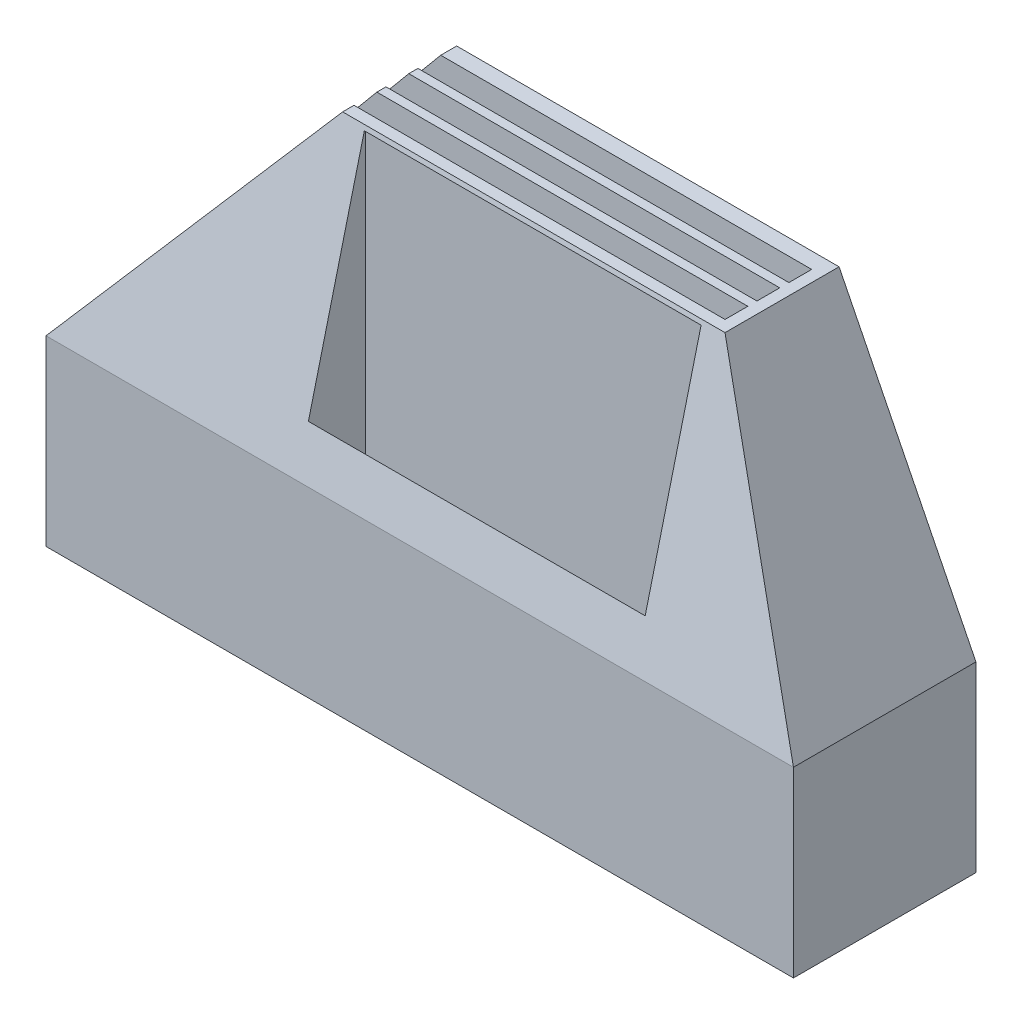
ISO-10303-21;
HEADER;
FILE_DESCRIPTION(('STEP AP214'),'2;1');
FILE_NAME('part.step','',(''),(''),'','','');
FILE_SCHEMA(('AUTOMOTIVE_DESIGN { 1 0 10303 214 1 1 1 1 }'));
ENDSEC;
DATA;
#1=APPLICATION_CONTEXT('core data for automotive mechanical design processes');
#2=APPLICATION_PROTOCOL_DEFINITION('international standard','automotive_design',2000,#1);
#3=PRODUCT_CONTEXT('',#1,'mechanical');
#4=PRODUCT('Part','Part','',(#3));
#5=PRODUCT_RELATED_PRODUCT_CATEGORY('part','',(#4));
#6=PRODUCT_DEFINITION_FORMATION('','',#4);
#7=PRODUCT_DEFINITION_CONTEXT('part definition',#1,'design');
#8=PRODUCT_DEFINITION('design','',#6,#7);
#9=PRODUCT_DEFINITION_SHAPE('','',#8);
#10=(LENGTH_UNIT() NAMED_UNIT(*) SI_UNIT(.MILLI.,.METRE.));
#11=(NAMED_UNIT(*) PLANE_ANGLE_UNIT() SI_UNIT($,.RADIAN.));
#12=(NAMED_UNIT(*) SI_UNIT($,.STERADIAN.) SOLID_ANGLE_UNIT());
#13=UNCERTAINTY_MEASURE_WITH_UNIT(LENGTH_MEASURE(1.E-05),#10,'distance_accuracy_value','');
#14=(GEOMETRIC_REPRESENTATION_CONTEXT(3) GLOBAL_UNCERTAINTY_ASSIGNED_CONTEXT((#13)) GLOBAL_UNIT_ASSIGNED_CONTEXT((#10,
#11,#12)) REPRESENTATION_CONTEXT('',''));
#15=CARTESIAN_POINT('',(0.,0.,0.));
#16=DIRECTION('',(0.,0.,1.));
#17=DIRECTION('',(1.,0.,0.));
#18=AXIS2_PLACEMENT_3D('',#15,#16,#17);
#19=CARTESIAN_POINT('',(0.,0.,0.));
#20=DIRECTION('',(0.,-1.,0.));
#21=DIRECTION('',(0.,0.,-1.));
#22=AXIS2_PLACEMENT_3D('',#19,#20,#21);
#23=PLANE('',#22);
#24=DIRECTION('',(0.,0.,1.));
#25=VECTOR('',#24,1.);
#26=CARTESIAN_POINT('',(0.,0.,0.));
#27=LINE('',#26,#25);
#28=CARTESIAN_POINT('',(-1.38777878078145E-13,0.,-101.6));
#29=VERTEX_POINT('',#28);
#30=CARTESIAN_POINT('',(0.,0.,0.));
#31=VERTEX_POINT('',#30);
#32=EDGE_CURVE('E416',#29,#31,#27,.T.);
#33=ORIENTED_EDGE('',*,*,#32,.F.);
#34=DIRECTION('',(-1.,0.,0.));
#35=VECTOR('',#34,1.);
#36=CARTESIAN_POINT('',(-1.38777878078145E-13,0.,-101.6));
#37=LINE('',#36,#35);
#38=CARTESIAN_POINT('',(416.08,0.,-101.6));
#39=VERTEX_POINT('',#38);
#40=EDGE_CURVE('E432',#39,#29,#37,.T.);
#41=ORIENTED_EDGE('',*,*,#40,.F.);
#42=DIRECTION('',(0.,0.,-1.));
#43=VECTOR('',#42,1.);
#44=CARTESIAN_POINT('',(416.08,0.,1.11022302462516E-13));
#45=LINE('',#44,#43);
#46=CARTESIAN_POINT('',(416.08,0.,1.11022302462516E-13));
#47=VERTEX_POINT('',#46);
#48=EDGE_CURVE('E438',#47,#39,#45,.T.);
#49=ORIENTED_EDGE('',*,*,#48,.F.);
#50=DIRECTION('',(1.,0.,0.));
#51=VECTOR('',#50,1.);
#52=CARTESIAN_POINT('',(0.,0.,0.));
#53=LINE('',#52,#51);
#54=EDGE_CURVE('E435',#31,#47,#53,.T.);
#55=ORIENTED_EDGE('',*,*,#54,.F.);
#56=EDGE_LOOP('',(#33,#41,#49,#55));
#57=FACE_BOUND('',#56,.T.);
#58=DIRECTION('',(1.,0.,0.));
#59=VECTOR('',#58,1.);
#60=CARTESIAN_POINT('',(139.7,0.,-6.35));
#61=LINE('',#60,#59);
#62=CARTESIAN_POINT('',(139.7,0.,-6.35));
#63=VERTEX_POINT('',#62);
#64=CARTESIAN_POINT('',(327.18,0.,-6.34999999999998));
#65=VERTEX_POINT('',#64);
#66=EDGE_CURVE('E383',#63,#65,#61,.T.);
#67=ORIENTED_EDGE('',*,*,#66,.T.);
#68=DIRECTION('',(0.,0.,-1.));
#69=VECTOR('',#68,1.);
#70=CARTESIAN_POINT('',(327.18,0.,-38.1));
#71=LINE('',#70,#69);
#72=CARTESIAN_POINT('',(327.18,0.,-38.1));
#73=VERTEX_POINT('',#72);
#74=EDGE_CURVE('E316',#65,#73,#71,.T.);
#75=ORIENTED_EDGE('',*,*,#74,.T.);
#76=DIRECTION('',(-1.,0.,0.));
#77=VECTOR('',#76,1.);
#78=CARTESIAN_POINT('',(139.7,0.,-38.1));
#79=LINE('',#78,#77);
#80=CARTESIAN_POINT('',(139.7,0.,-38.1));
#81=VERTEX_POINT('',#80);
#82=EDGE_CURVE('E391',#73,#81,#79,.T.);
#83=ORIENTED_EDGE('',*,*,#82,.T.);
#84=DIRECTION('',(0.,0.,1.));
#85=VECTOR('',#84,1.);
#86=CARTESIAN_POINT('',(139.7,0.,-38.1));
#87=LINE('',#86,#85);
#88=EDGE_CURVE('E394',#81,#63,#87,.T.);
#89=ORIENTED_EDGE('',*,*,#88,.T.);
#90=EDGE_LOOP('',(#67,#75,#83,#89));
#91=FACE_BOUND('',#90,.T.);
#92=ADVANCED_FACE('F41',(#57,#91),#23,.T.);
#93=CARTESIAN_POINT('',(0.,254.,0.));
#94=DIRECTION('',(1.,0.,0.));
#95=DIRECTION('',(0.,0.,-1.));
#96=AXIS2_PLACEMENT_3D('',#93,#94,#95);
#97=PLANE('',#96);
#98=DIRECTION('',(0.,-1.,0.));
#99=VECTOR('',#98,1.);
#100=CARTESIAN_POINT('',(0.,254.,0.));
#101=LINE('',#100,#99);
#102=CARTESIAN_POINT('',(-1.11022302462516E-13,101.6,0.));
#103=VERTEX_POINT('',#102);
#104=EDGE_CURVE('E448',#103,#31,#101,.T.);
#105=ORIENTED_EDGE('',*,*,#104,.F.);
#106=DIRECTION('',(0.,0.,1.));
#107=VECTOR('',#106,1.);
#108=CARTESIAN_POINT('',(0.,101.6,-101.6));
#109=LINE('',#108,#107);
#110=CARTESIAN_POINT('',(0.,101.6,-101.6));
#111=VERTEX_POINT('',#110);
#112=EDGE_CURVE('E413',#111,#103,#109,.T.);
#113=ORIENTED_EDGE('',*,*,#112,.F.);
#114=DIRECTION('',(0.,-1.,0.));
#115=VECTOR('',#114,1.);
#116=CARTESIAN_POINT('',(-1.38777878078145E-13,254.,-101.6));
#117=LINE('',#116,#115);
#118=EDGE_CURVE('E431',#111,#29,#117,.T.);
#119=ORIENTED_EDGE('',*,*,#118,.T.);
#120=ORIENTED_EDGE('',*,*,#32,.T.);
#121=EDGE_LOOP('',(#105,#113,#119,#120));
#122=FACE_BOUND('',#121,.T.);
#123=ADVANCED_FACE('F43',(#122),#97,.F.);
#124=CARTESIAN_POINT('',(0.,254.,0.));
#125=DIRECTION('',(0.,0.,-1.));
#126=DIRECTION('',(-1.,0.,0.));
#127=AXIS2_PLACEMENT_3D('',#124,#125,#126);
#128=PLANE('',#127);
#129=DIRECTION('',(0.,-1.,0.));
#130=VECTOR('',#129,1.);
#131=CARTESIAN_POINT('',(416.08,254.,1.11022302462516E-13));
#132=LINE('',#131,#130);
#133=CARTESIAN_POINT('',(416.08,101.6,0.));
#134=VERTEX_POINT('',#133);
#135=EDGE_CURVE('E446',#134,#47,#132,.T.);
#136=ORIENTED_EDGE('',*,*,#135,.F.);
#137=DIRECTION('',(1.,0.,0.));
#138=VECTOR('',#137,1.);
#139=CARTESIAN_POINT('',(-1.11022302462516E-13,101.6,0.));
#140=LINE('',#139,#138);
#141=EDGE_CURVE('E252',#103,#134,#140,.T.);
#142=ORIENTED_EDGE('',*,*,#141,.F.);
#143=ORIENTED_EDGE('',*,*,#104,.T.);
#144=ORIENTED_EDGE('',*,*,#54,.T.);
#145=EDGE_LOOP('',(#136,#142,#143,#144));
#146=FACE_BOUND('',#145,.T.);
#147=ADVANCED_FACE('F538',(#146),#128,.F.);
#148=CARTESIAN_POINT('',(416.08,254.,1.11022302462516E-13));
#149=DIRECTION('',(-1.,0.,0.));
#150=DIRECTION('',(0.,0.,1.));
#151=AXIS2_PLACEMENT_3D('',#148,#149,#150);
#152=PLANE('',#151);
#153=DIRECTION('',(0.,-1.,0.));
#154=VECTOR('',#153,1.);
#155=CARTESIAN_POINT('',(416.08,254.,-101.6));
#156=LINE('',#155,#154);
#157=CARTESIAN_POINT('',(416.08,101.6,-101.6));
#158=VERTEX_POINT('',#157);
#159=EDGE_CURVE('E444',#158,#39,#156,.T.);
#160=ORIENTED_EDGE('',*,*,#159,.F.);
#161=DIRECTION('',(0.,0.,1.));
#162=VECTOR('',#161,1.);
#163=CARTESIAN_POINT('',(416.08,101.6,-101.6));
#164=LINE('',#163,#162);
#165=EDGE_CURVE('E407',#158,#134,#164,.T.);
#166=ORIENTED_EDGE('',*,*,#165,.T.);
#167=ORIENTED_EDGE('',*,*,#135,.T.);
#168=ORIENTED_EDGE('',*,*,#48,.T.);
#169=EDGE_LOOP('',(#160,#166,#167,#168));
#170=FACE_BOUND('',#169,.T.);
#171=ADVANCED_FACE('F547',(#170),#152,.F.);
#172=CARTESIAN_POINT('',(-1.38777878078145E-13,254.,-101.6));
#173=DIRECTION('',(0.,0.,1.));
#174=DIRECTION('',(1.,0.,0.));
#175=AXIS2_PLACEMENT_3D('',#172,#173,#174);
#176=PLANE('',#175);
#177=DIRECTION('',(-1.,0.,0.));
#178=VECTOR('',#177,1.);
#179=CARTESIAN_POINT('',(314.48,10.4540584538938,-101.6));
#180=LINE('',#179,#178);
#181=CARTESIAN_POINT('',(314.48,10.4540584538938,-101.6));
#182=VERTEX_POINT('',#181);
#183=CARTESIAN_POINT('',(152.4,10.4540584538938,-101.6));
#184=VERTEX_POINT('',#183);
#185=EDGE_CURVE('E258',#182,#184,#180,.T.);
#186=ORIENTED_EDGE('',*,*,#185,.F.);
#187=DIRECTION('',(0.,-1.,0.));
#188=VECTOR('',#187,1.);
#189=CARTESIAN_POINT('',(314.48,10.4540584538938,-101.6));
#190=LINE('',#189,#188);
#191=CARTESIAN_POINT('',(314.48,23.6587076548535,-101.6));
#192=VERTEX_POINT('',#191);
#193=EDGE_CURVE('E240',#192,#182,#190,.T.);
#194=ORIENTED_EDGE('',*,*,#193,.F.);
#195=DIRECTION('',(1.,0.,0.));
#196=VECTOR('',#195,1.);
#197=CARTESIAN_POINT('',(314.48,23.6587076548535,-101.6));
#198=LINE('',#197,#196);
#199=CARTESIAN_POINT('',(152.4,23.6587076548535,-101.6));
#200=VERTEX_POINT('',#199);
#201=EDGE_CURVE('E249',#200,#192,#198,.T.);
#202=ORIENTED_EDGE('',*,*,#201,.F.);
#203=DIRECTION('',(0.,1.,0.));
#204=VECTOR('',#203,1.);
#205=CARTESIAN_POINT('',(152.4,10.4540584538938,-101.6));
#206=LINE('',#205,#204);
#207=EDGE_CURVE('E56',#184,#200,#206,.T.);
#208=ORIENTED_EDGE('',*,*,#207,.F.);
#209=EDGE_LOOP('',(#186,#194,#202,#208));
#210=FACE_BOUND('',#209,.T.);
#211=ORIENTED_EDGE('',*,*,#118,.F.);
#212=DIRECTION('',(0.64018439966448,0.768221279597376,0.));
#213=VECTOR('',#212,1.);
#214=CARTESIAN_POINT('',(127.,254.,-101.6));
#215=LINE('',#214,#213);
#216=CARTESIAN_POINT('',(127.,254.,-101.6));
#217=VERTEX_POINT('',#216);
#218=EDGE_CURVE('E408',#111,#217,#215,.T.);
#219=ORIENTED_EDGE('',*,*,#218,.T.);
#220=DIRECTION('',(-1.,0.,0.));
#221=VECTOR('',#220,1.);
#222=CARTESIAN_POINT('',(-1.38777878078145E-13,254.,-101.6));
#223=LINE('',#222,#221);
#224=CARTESIAN_POINT('',(339.88,254.,-101.6));
#225=VERTEX_POINT('',#224);
#226=EDGE_CURVE('E428',#225,#217,#223,.T.);
#227=ORIENTED_EDGE('',*,*,#226,.F.);
#228=DIRECTION('',(0.447213595499958,-0.894427190999916,0.));
#229=VECTOR('',#228,1.);
#230=CARTESIAN_POINT('',(416.08,101.6,-101.6));
#231=LINE('',#230,#229);
#232=EDGE_CURVE('E412',#225,#158,#231,.T.);
#233=ORIENTED_EDGE('',*,*,#232,.T.);
#234=ORIENTED_EDGE('',*,*,#159,.T.);
#235=ORIENTED_EDGE('',*,*,#40,.T.);
#236=EDGE_LOOP('',(#211,#219,#227,#233,#234,#235));
#237=FACE_BOUND('',#236,.T.);
#238=ADVANCED_FACE('F255',(#210,#237),#176,.F.);
#239=CARTESIAN_POINT('',(0.,254.,0.));
#240=DIRECTION('',(0.,-1.,0.));
#241=DIRECTION('',(0.,0.,-1.));
#242=AXIS2_PLACEMENT_3D('',#239,#240,#241);
#243=PLANE('',#242);
#244=DIRECTION('',(0.,0.,1.));
#245=VECTOR('',#244,1.);
#246=CARTESIAN_POINT('',(127.,254.,-101.6));
#247=LINE('',#246,#245);
#248=CARTESIAN_POINT('',(127.,254.,-44.45));
#249=VERTEX_POINT('',#248);
#250=CARTESIAN_POINT('',(127.,254.,-38.1));
#251=VERTEX_POINT('',#250);
#252=EDGE_CURVE('E411',#249,#251,#247,.T.);
#253=ORIENTED_EDGE('',*,*,#252,.T.);
#254=DIRECTION('',(1.,0.,0.));
#255=VECTOR('',#254,1.);
#256=CARTESIAN_POINT('',(-1.11022302462516E-13,254.,-38.1));
#257=LINE('',#256,#255);
#258=CARTESIAN_POINT('',(339.88,254.,-38.1));
#259=VERTEX_POINT('',#258);
#260=EDGE_CURVE('E275',#251,#259,#257,.T.);
#261=ORIENTED_EDGE('',*,*,#260,.T.);
#262=DIRECTION('',(0.,0.,1.));
#263=VECTOR('',#262,1.);
#264=CARTESIAN_POINT('',(339.88,254.,-101.6));
#265=LINE('',#264,#263);
#266=EDGE_CURVE('E421',#225,#259,#265,.T.);
#267=ORIENTED_EDGE('',*,*,#266,.F.);
#268=ORIENTED_EDGE('',*,*,#226,.T.);
#269=CARTESIAN_POINT('',(127.,254.,-92.71));
#270=VERTEX_POINT('',#269);
#271=EDGE_CURVE('E417',#217,#270,#247,.T.);
#272=ORIENTED_EDGE('',*,*,#271,.T.);
#273=DIRECTION('',(-1.,0.,0.));
#274=VECTOR('',#273,1.);
#275=CARTESIAN_POINT('',(6.34999999999974,254.,-92.71));
#276=LINE('',#275,#274);
#277=CARTESIAN_POINT('',(333.53,254.,-92.71));
#278=VERTEX_POINT('',#277);
#279=EDGE_CURVE('E335',#278,#270,#276,.T.);
#280=ORIENTED_EDGE('',*,*,#279,.F.);
#281=DIRECTION('',(0.,0.,-1.));
#282=VECTOR('',#281,1.);
#283=CARTESIAN_POINT('',(333.53,254.,-80.01));
#284=LINE('',#283,#282);
#285=CARTESIAN_POINT('',(333.53,254.,-80.01));
#286=VERTEX_POINT('',#285);
#287=EDGE_CURVE('E363',#286,#278,#284,.T.);
#288=ORIENTED_EDGE('',*,*,#287,.F.);
#289=DIRECTION('',(1.,0.,0.));
#290=VECTOR('',#289,1.);
#291=CARTESIAN_POINT('',(6.34999999999974,254.,-80.01));
#292=LINE('',#291,#290);
#293=CARTESIAN_POINT('',(127.,254.,-80.01));
#294=VERTEX_POINT('',#293);
#295=EDGE_CURVE('E366',#294,#286,#292,.T.);
#296=ORIENTED_EDGE('',*,*,#295,.F.);
#297=CARTESIAN_POINT('',(127.,254.,-74.93));
#298=VERTEX_POINT('',#297);
#299=EDGE_CURVE('E420',#294,#298,#247,.T.);
#300=ORIENTED_EDGE('',*,*,#299,.T.);
#301=DIRECTION('',(-1.,0.,0.));
#302=VECTOR('',#301,1.);
#303=CARTESIAN_POINT('',(6.3499999999998,254.,-74.93));
#304=LINE('',#303,#302);
#305=CARTESIAN_POINT('',(333.53,254.,-74.93));
#306=VERTEX_POINT('',#305);
#307=EDGE_CURVE('E310',#306,#298,#304,.T.);
#308=ORIENTED_EDGE('',*,*,#307,.F.);
#309=DIRECTION('',(0.,0.,-1.));
#310=VECTOR('',#309,1.);
#311=CARTESIAN_POINT('',(333.53,254.,-62.23));
#312=LINE('',#311,#310);
#313=CARTESIAN_POINT('',(333.53,254.,-62.23));
#314=VERTEX_POINT('',#313);
#315=EDGE_CURVE('E336',#314,#306,#312,.T.);
#316=ORIENTED_EDGE('',*,*,#315,.F.);
#317=DIRECTION('',(1.,0.,0.));
#318=VECTOR('',#317,1.);
#319=CARTESIAN_POINT('',(6.3499999999998,254.,-62.23));
#320=LINE('',#319,#318);
#321=CARTESIAN_POINT('',(127.,254.,-62.23));
#322=VERTEX_POINT('',#321);
#323=EDGE_CURVE('E339',#322,#314,#320,.T.);
#324=ORIENTED_EDGE('',*,*,#323,.F.);
#325=CARTESIAN_POINT('',(127.,254.,-57.15));
#326=VERTEX_POINT('',#325);
#327=EDGE_CURVE('E499',#322,#326,#247,.T.);
#328=ORIENTED_EDGE('',*,*,#327,.T.);
#329=DIRECTION('',(-1.,0.,0.));
#330=VECTOR('',#329,1.);
#331=CARTESIAN_POINT('',(6.34999999999986,254.,-57.15));
#332=LINE('',#331,#330);
#333=CARTESIAN_POINT('',(333.53,254.,-57.15));
#334=VERTEX_POINT('',#333);
#335=EDGE_CURVE('E309',#334,#326,#332,.T.);
#336=ORIENTED_EDGE('',*,*,#335,.F.);
#337=DIRECTION('',(0.,0.,-1.));
#338=VECTOR('',#337,1.);
#339=CARTESIAN_POINT('',(333.53,254.,-44.45));
#340=LINE('',#339,#338);
#341=CARTESIAN_POINT('',(333.53,254.,-44.45));
#342=VERTEX_POINT('',#341);
#343=EDGE_CURVE('E306',#342,#334,#340,.T.);
#344=ORIENTED_EDGE('',*,*,#343,.F.);
#345=DIRECTION('',(1.,0.,0.));
#346=VECTOR('',#345,1.);
#347=CARTESIAN_POINT('',(6.34999999999986,254.,-44.45));
#348=LINE('',#347,#346);
#349=EDGE_CURVE('E296',#249,#342,#348,.T.);
#350=ORIENTED_EDGE('',*,*,#349,.F.);
#351=EDGE_LOOP('',(#253,#261,#267,#268,#272,#280,#288,#296,#300,#308,#316,#324,#328,#336,#344,#350));
#352=FACE_BOUND('',#351,.T.);
#353=ADVANCED_FACE('F484',(#352),#243,.F.);
#354=CARTESIAN_POINT('',(416.08,101.6,-101.6));
#355=DIRECTION('',(-0.894427190999916,-0.447213595499958,0.));
#356=DIRECTION('',(0.447213595499958,-0.894427190999916,0.));
#357=AXIS2_PLACEMENT_3D('',#354,#355,#356);
#358=PLANE('',#357);
#359=ORIENTED_EDGE('',*,*,#266,.T.);
#360=DIRECTION('',(0.436435780471985,-0.87287156094397,0.218217890235992));
#361=VECTOR('',#360,1.);
#362=CARTESIAN_POINT('',(406.403809523809,120.952380952381,-4.83809523809524));
#363=LINE('',#362,#361);
#364=EDGE_CURVE('E288',#259,#134,#363,.T.);
#365=ORIENTED_EDGE('',*,*,#364,.T.);
#366=ORIENTED_EDGE('',*,*,#165,.F.);
#367=ORIENTED_EDGE('',*,*,#232,.F.);
#368=EDGE_LOOP('',(#359,#365,#366,#367));
#369=FACE_BOUND('',#368,.T.);
#370=ADVANCED_FACE('F561',(#369),#358,.F.);
#371=CARTESIAN_POINT('',(127.,254.,-101.6));
#372=DIRECTION('',(0.768221279597376,-0.64018439966448,0.));
#373=DIRECTION('',(0.64018439966448,0.768221279597376,0.));
#374=AXIS2_PLACEMENT_3D('',#371,#372,#373);
#375=PLANE('',#374);
#376=ORIENTED_EDGE('',*,*,#112,.T.);
#377=DIRECTION('',(0.628694613461931,0.754433536154318,-0.188608384038579));
#378=VECTOR('',#377,1.);
#379=CARTESIAN_POINT('',(134.529644268775,263.03557312253,-40.3588932806324));
#380=LINE('',#379,#378);
#381=EDGE_CURVE('E285',#103,#251,#380,.T.);
#382=ORIENTED_EDGE('',*,*,#381,.T.);
#383=ORIENTED_EDGE('',*,*,#252,.F.);
#384=DIRECTION('',(-0.64018439966448,-0.768221279597376,0.));
#385=VECTOR('',#384,1.);
#386=CARTESIAN_POINT('',(127.,254.,-44.45));
#387=LINE('',#386,#385);
#388=CARTESIAN_POINT('',(6.34999999999986,109.22,-44.45));
#389=VERTEX_POINT('',#388);
#390=EDGE_CURVE('E49',#249,#389,#387,.T.);
#391=ORIENTED_EDGE('',*,*,#390,.T.);
#392=DIRECTION('',(0.,0.,-1.));
#393=VECTOR('',#392,1.);
#394=CARTESIAN_POINT('',(6.34999999999986,109.22,-101.6));
#395=LINE('',#394,#393);
#396=CARTESIAN_POINT('',(6.3499999999998,109.22,-57.15));
#397=VERTEX_POINT('',#396);
#398=EDGE_CURVE('E471',#389,#397,#395,.T.);
#399=ORIENTED_EDGE('',*,*,#398,.T.);
#400=DIRECTION('',(0.64018439966448,0.768221279597376,0.));
#401=VECTOR('',#400,1.);
#402=CARTESIAN_POINT('',(127.,254.,-57.15));
#403=LINE('',#402,#401);
#404=EDGE_CURVE('E468',#397,#326,#403,.T.);
#405=ORIENTED_EDGE('',*,*,#404,.T.);
#406=ORIENTED_EDGE('',*,*,#327,.F.);
#407=DIRECTION('',(-0.64018439966448,-0.768221279597376,0.));
#408=VECTOR('',#407,1.);
#409=CARTESIAN_POINT('',(127.,254.,-62.23));
#410=LINE('',#409,#408);
#411=CARTESIAN_POINT('',(6.3499999999998,109.22,-62.23));
#412=VERTEX_POINT('',#411);
#413=EDGE_CURVE('E462',#322,#412,#410,.T.);
#414=ORIENTED_EDGE('',*,*,#413,.T.);
#415=DIRECTION('',(0.,0.,-1.));
#416=VECTOR('',#415,1.);
#417=CARTESIAN_POINT('',(6.3499999999998,109.22,-101.6));
#418=LINE('',#417,#416);
#419=CARTESIAN_POINT('',(6.3499999999998,109.22,-74.93));
#420=VERTEX_POINT('',#419);
#421=EDGE_CURVE('E459',#412,#420,#418,.T.);
#422=ORIENTED_EDGE('',*,*,#421,.T.);
#423=DIRECTION('',(0.64018439966448,0.768221279597376,0.));
#424=VECTOR('',#423,1.);
#425=CARTESIAN_POINT('',(127.,254.,-74.93));
#426=LINE('',#425,#424);
#427=EDGE_CURVE('E465',#420,#298,#426,.T.);
#428=ORIENTED_EDGE('',*,*,#427,.T.);
#429=ORIENTED_EDGE('',*,*,#299,.F.);
#430=DIRECTION('',(-0.64018439966448,-0.768221279597376,0.));
#431=VECTOR('',#430,1.);
#432=CARTESIAN_POINT('',(127.,254.,-80.01));
#433=LINE('',#432,#431);
#434=CARTESIAN_POINT('',(6.34999999999974,109.22,-80.01));
#435=VERTEX_POINT('',#434);
#436=EDGE_CURVE('E453',#294,#435,#433,.T.);
#437=ORIENTED_EDGE('',*,*,#436,.T.);
#438=DIRECTION('',(0.,0.,-1.));
#439=VECTOR('',#438,1.);
#440=CARTESIAN_POINT('',(6.34999999999974,109.22,-101.6));
#441=LINE('',#440,#439);
#442=CARTESIAN_POINT('',(6.34999999999974,109.22,-92.71));
#443=VERTEX_POINT('',#442);
#444=EDGE_CURVE('E450',#435,#443,#441,.T.);
#445=ORIENTED_EDGE('',*,*,#444,.T.);
#446=DIRECTION('',(0.64018439966448,0.768221279597376,0.));
#447=VECTOR('',#446,1.);
#448=CARTESIAN_POINT('',(127.,254.,-92.71));
#449=LINE('',#448,#447);
#450=EDGE_CURVE('E456',#443,#270,#449,.T.);
#451=ORIENTED_EDGE('',*,*,#450,.T.);
#452=ORIENTED_EDGE('',*,*,#271,.F.);
#453=ORIENTED_EDGE('',*,*,#218,.F.);
#454=EDGE_LOOP('',(#376,#382,#383,#391,#399,#405,#406,#414,#422,#428,#429,#437,#445,#451,#452,#453));
#455=FACE_BOUND('',#454,.T.);
#456=ADVANCED_FACE('F476',(#455),#375,.F.);
#457=CARTESIAN_POINT('',(327.18,251.554,-38.1));
#458=DIRECTION('',(-1.,0.,0.));
#459=DIRECTION('',(0.,0.,1.));
#460=AXIS2_PLACEMENT_3D('',#457,#458,#459);
#461=PLANE('',#460);
#462=DIRECTION('',(0.,-0.970142500145332,0.242535625036333));
#463=VECTOR('',#462,1.);
#464=CARTESIAN_POINT('',(327.18,251.697882352941,-37.5244705882353));
#465=LINE('',#464,#463);
#466=CARTESIAN_POINT('',(327.18,251.554,-37.4885));
#467=VERTEX_POINT('',#466);
#468=CARTESIAN_POINT('',(327.18,127.,-6.34999999999998));
#469=VERTEX_POINT('',#468);
#470=EDGE_CURVE('E281',#467,#469,#465,.T.);
#471=ORIENTED_EDGE('',*,*,#470,.F.);
#472=DIRECTION('',(0.,0.,-1.));
#473=VECTOR('',#472,1.);
#474=CARTESIAN_POINT('',(327.18,251.554,-38.1));
#475=LINE('',#474,#473);
#476=CARTESIAN_POINT('',(327.18,251.554,-38.1));
#477=VERTEX_POINT('',#476);
#478=EDGE_CURVE('E380',#467,#477,#475,.T.);
#479=ORIENTED_EDGE('',*,*,#478,.T.);
#480=DIRECTION('',(0.,-1.,0.));
#481=VECTOR('',#480,1.);
#482=CARTESIAN_POINT('',(327.18,251.554,-38.1));
#483=LINE('',#482,#481);
#484=EDGE_CURVE('E404',#477,#73,#483,.T.);
#485=ORIENTED_EDGE('',*,*,#484,.T.);
#486=ORIENTED_EDGE('',*,*,#74,.F.);
#487=DIRECTION('',(0.,-1.,0.));
#488=VECTOR('',#487,1.);
#489=CARTESIAN_POINT('',(327.18,251.554,-6.34999999999998));
#490=LINE('',#489,#488);
#491=EDGE_CURVE('E388',#469,#65,#490,.T.);
#492=ORIENTED_EDGE('',*,*,#491,.F.);
#493=EDGE_LOOP('',(#471,#479,#485,#486,#492));
#494=FACE_BOUND('',#493,.T.);
#495=ADVANCED_FACE('F613',(#494),#461,.T.);
#496=CARTESIAN_POINT('',(139.7,251.554,-38.1));
#497=DIRECTION('',(0.,0.,1.));
#498=DIRECTION('',(1.,0.,0.));
#499=AXIS2_PLACEMENT_3D('',#496,#497,#498);
#500=PLANE('',#499);
#501=DIRECTION('',(0.,1.,0.));
#502=VECTOR('',#501,1.);
#503=CARTESIAN_POINT('',(314.48,10.4540584538938,-38.1));
#504=LINE('',#503,#502);
#505=CARTESIAN_POINT('',(314.48,10.4540584538938,-38.1));
#506=VERTEX_POINT('',#505);
#507=CARTESIAN_POINT('',(314.48,23.6587076548535,-38.1));
#508=VERTEX_POINT('',#507);
#509=EDGE_CURVE('E64',#506,#508,#504,.T.);
#510=ORIENTED_EDGE('',*,*,#509,.F.);
#511=DIRECTION('',(1.,0.,0.));
#512=VECTOR('',#511,1.);
#513=CARTESIAN_POINT('',(314.48,10.4540584538938,-38.1));
#514=LINE('',#513,#512);
#515=CARTESIAN_POINT('',(152.4,10.4540584538938,-38.1));
#516=VERTEX_POINT('',#515);
#517=EDGE_CURVE('E246',#516,#506,#514,.T.);
#518=ORIENTED_EDGE('',*,*,#517,.F.);
#519=DIRECTION('',(0.,-1.,0.));
#520=VECTOR('',#519,1.);
#521=CARTESIAN_POINT('',(152.4,10.4540584538938,-38.1));
#522=LINE('',#521,#520);
#523=CARTESIAN_POINT('',(152.4,23.6587076548535,-38.1));
#524=VERTEX_POINT('',#523);
#525=EDGE_CURVE('E266',#524,#516,#522,.T.);
#526=ORIENTED_EDGE('',*,*,#525,.F.);
#527=DIRECTION('',(-1.,0.,0.));
#528=VECTOR('',#527,1.);
#529=CARTESIAN_POINT('',(314.48,23.6587076548535,-38.1));
#530=LINE('',#529,#528);
#531=EDGE_CURVE('E260',#508,#524,#530,.T.);
#532=ORIENTED_EDGE('',*,*,#531,.F.);
#533=EDGE_LOOP('',(#510,#518,#526,#532));
#534=FACE_BOUND('',#533,.T.);
#535=ORIENTED_EDGE('',*,*,#82,.F.);
#536=ORIENTED_EDGE('',*,*,#484,.F.);
#537=DIRECTION('',(-1.,0.,0.));
#538=VECTOR('',#537,1.);
#539=CARTESIAN_POINT('',(139.7,251.554,-38.1));
#540=LINE('',#539,#538);
#541=CARTESIAN_POINT('',(139.7,251.554,-38.1));
#542=VERTEX_POINT('',#541);
#543=EDGE_CURVE('E382',#477,#542,#540,.T.);
#544=ORIENTED_EDGE('',*,*,#543,.T.);
#545=DIRECTION('',(0.,-1.,0.));
#546=VECTOR('',#545,1.);
#547=CARTESIAN_POINT('',(139.7,251.554,-38.1));
#548=LINE('',#547,#546);
#549=EDGE_CURVE('E402',#542,#81,#548,.T.);
#550=ORIENTED_EDGE('',*,*,#549,.T.);
#551=EDGE_LOOP('',(#535,#536,#544,#550));
#552=FACE_BOUND('',#551,.T.);
#553=ADVANCED_FACE('F609',(#534,#552),#500,.T.);
#554=CARTESIAN_POINT('',(139.7,251.554,-38.1));
#555=DIRECTION('',(1.,0.,0.));
#556=DIRECTION('',(0.,0.,-1.));
#557=AXIS2_PLACEMENT_3D('',#554,#555,#556);
#558=PLANE('',#557);
#559=DIRECTION('',(0.,0.970142500145332,-0.242535625036333));
#560=VECTOR('',#559,1.);
#561=CARTESIAN_POINT('',(139.7,251.697882352941,-37.5244705882353));
#562=LINE('',#561,#560);
#563=CARTESIAN_POINT('',(139.7,127.,-6.35));
#564=VERTEX_POINT('',#563);
#565=CARTESIAN_POINT('',(139.7,251.554,-37.4885));
#566=VERTEX_POINT('',#565);
#567=EDGE_CURVE('E278',#564,#566,#562,.T.);
#568=ORIENTED_EDGE('',*,*,#567,.F.);
#569=DIRECTION('',(0.,-1.,0.));
#570=VECTOR('',#569,1.);
#571=CARTESIAN_POINT('',(139.7,251.554,-6.35));
#572=LINE('',#571,#570);
#573=EDGE_CURVE('E400',#564,#63,#572,.T.);
#574=ORIENTED_EDGE('',*,*,#573,.T.);
#575=ORIENTED_EDGE('',*,*,#88,.F.);
#576=ORIENTED_EDGE('',*,*,#549,.F.);
#577=DIRECTION('',(0.,0.,1.));
#578=VECTOR('',#577,1.);
#579=CARTESIAN_POINT('',(139.7,251.554,-38.1));
#580=LINE('',#579,#578);
#581=EDGE_CURVE('E385',#542,#566,#580,.T.);
#582=ORIENTED_EDGE('',*,*,#581,.T.);
#583=EDGE_LOOP('',(#568,#574,#575,#576,#582));
#584=FACE_BOUND('',#583,.T.);
#585=ADVANCED_FACE('F605',(#584),#558,.T.);
#586=CARTESIAN_POINT('',(139.7,251.554,-6.35));
#587=DIRECTION('',(0.,0.,-1.));
#588=DIRECTION('',(-1.,0.,0.));
#589=AXIS2_PLACEMENT_3D('',#586,#587,#588);
#590=PLANE('',#589);
#591=DIRECTION('',(-1.,0.,0.));
#592=VECTOR('',#591,1.);
#593=CARTESIAN_POINT('',(139.7,127.,-6.35));
#594=LINE('',#593,#592);
#595=EDGE_CURVE('E283',#469,#564,#594,.T.);
#596=ORIENTED_EDGE('',*,*,#595,.F.);
#597=ORIENTED_EDGE('',*,*,#491,.T.);
#598=ORIENTED_EDGE('',*,*,#66,.F.);
#599=ORIENTED_EDGE('',*,*,#573,.F.);
#600=EDGE_LOOP('',(#596,#597,#598,#599));
#601=FACE_BOUND('',#600,.T.);
#602=ADVANCED_FACE('F601',(#601),#590,.T.);
#603=CARTESIAN_POINT('',(0.,251.554,0.));
#604=DIRECTION('',(0.,1.,0.));
#605=DIRECTION('',(0.,0.,1.));
#606=AXIS2_PLACEMENT_3D('',#603,#604,#605);
#607=PLANE('',#606);
#608=ORIENTED_EDGE('',*,*,#478,.F.);
#609=DIRECTION('',(-1.,0.,0.));
#610=VECTOR('',#609,1.);
#611=CARTESIAN_POINT('',(0.,251.554,-37.4885));
#612=LINE('',#611,#610);
#613=EDGE_CURVE('E12',#467,#566,#612,.T.);
#614=ORIENTED_EDGE('',*,*,#613,.T.);
#615=ORIENTED_EDGE('',*,*,#581,.F.);
#616=ORIENTED_EDGE('',*,*,#543,.F.);
#617=EDGE_LOOP('',(#608,#614,#615,#616));
#618=FACE_BOUND('',#617,.T.);
#619=ADVANCED_FACE('F598',(#618),#607,.F.);
#620=CARTESIAN_POINT('',(6.34999999999974,25.4,-92.71));
#621=DIRECTION('',(0.,0.,-1.));
#622=DIRECTION('',(-1.,0.,0.));
#623=AXIS2_PLACEMENT_3D('',#620,#621,#622);
#624=PLANE('',#623);
#625=DIRECTION('',(0.,1.,0.));
#626=VECTOR('',#625,1.);
#627=CARTESIAN_POINT('',(6.34999999999974,25.4,-92.71));
#628=LINE('',#627,#626);
#629=CARTESIAN_POINT('',(6.34999999999974,25.4,-92.71));
#630=VERTEX_POINT('',#629);
#631=EDGE_CURVE('E353',#630,#443,#628,.T.);
#632=ORIENTED_EDGE('',*,*,#631,.F.);
#633=DIRECTION('',(-1.,0.,0.));
#634=VECTOR('',#633,1.);
#635=CARTESIAN_POINT('',(6.34999999999974,25.4,-92.71));
#636=LINE('',#635,#634);
#637=CARTESIAN_POINT('',(333.53,25.4,-92.71));
#638=VERTEX_POINT('',#637);
#639=EDGE_CURVE('E367',#638,#630,#636,.T.);
#640=ORIENTED_EDGE('',*,*,#639,.F.);
#641=DIRECTION('',(0.,1.,0.));
#642=VECTOR('',#641,1.);
#643=CARTESIAN_POINT('',(333.53,25.4,-92.71));
#644=LINE('',#643,#642);
#645=EDGE_CURVE('E291',#638,#278,#644,.T.);
#646=ORIENTED_EDGE('',*,*,#645,.T.);
#647=ORIENTED_EDGE('',*,*,#279,.T.);
#648=ORIENTED_EDGE('',*,*,#450,.F.);
#649=EDGE_LOOP('',(#632,#640,#646,#647,#648));
#650=FACE_BOUND('',#649,.T.);
#651=ADVANCED_FACE('F572',(#650),#624,.F.);
#652=CARTESIAN_POINT('',(6.34999999999974,25.4,-80.01));
#653=DIRECTION('',(0.,0.,1.));
#654=DIRECTION('',(1.,0.,0.));
#655=AXIS2_PLACEMENT_3D('',#652,#653,#654);
#656=PLANE('',#655);
#657=ORIENTED_EDGE('',*,*,#295,.T.);
#658=DIRECTION('',(0.,1.,0.));
#659=VECTOR('',#658,1.);
#660=CARTESIAN_POINT('',(333.53,25.4,-80.01));
#661=LINE('',#660,#659);
#662=CARTESIAN_POINT('',(333.53,25.4,-80.01));
#663=VERTEX_POINT('',#662);
#664=EDGE_CURVE('E359',#663,#286,#661,.T.);
#665=ORIENTED_EDGE('',*,*,#664,.F.);
#666=DIRECTION('',(1.,0.,0.));
#667=VECTOR('',#666,1.);
#668=CARTESIAN_POINT('',(6.34999999999974,25.4,-80.01));
#669=LINE('',#668,#667);
#670=CARTESIAN_POINT('',(6.34999999999974,25.4,-80.01));
#671=VERTEX_POINT('',#670);
#672=EDGE_CURVE('E372',#671,#663,#669,.T.);
#673=ORIENTED_EDGE('',*,*,#672,.F.);
#674=DIRECTION('',(0.,1.,0.));
#675=VECTOR('',#674,1.);
#676=CARTESIAN_POINT('',(6.34999999999974,25.4,-80.01));
#677=LINE('',#676,#675);
#678=EDGE_CURVE('E356',#671,#435,#677,.T.);
#679=ORIENTED_EDGE('',*,*,#678,.T.);
#680=ORIENTED_EDGE('',*,*,#436,.F.);
#681=EDGE_LOOP('',(#657,#665,#673,#679,#680));
#682=FACE_BOUND('',#681,.T.);
#683=ADVANCED_FACE('F580',(#682),#656,.F.);
#684=CARTESIAN_POINT('',(6.34999999999974,25.4,-80.01));
#685=DIRECTION('',(-1.,0.,0.));
#686=DIRECTION('',(0.,0.,1.));
#687=AXIS2_PLACEMENT_3D('',#684,#685,#686);
#688=PLANE('',#687);
#689=ORIENTED_EDGE('',*,*,#678,.F.);
#690=DIRECTION('',(0.,0.,1.));
#691=VECTOR('',#690,1.);
#692=CARTESIAN_POINT('',(6.34999999999974,25.4,-80.01));
#693=LINE('',#692,#691);
#694=EDGE_CURVE('E375',#630,#671,#693,.T.);
#695=ORIENTED_EDGE('',*,*,#694,.F.);
#696=ORIENTED_EDGE('',*,*,#631,.T.);
#697=ORIENTED_EDGE('',*,*,#444,.F.);
#698=EDGE_LOOP('',(#689,#695,#696,#697));
#699=FACE_BOUND('',#698,.T.);
#700=ADVANCED_FACE('F584',(#699),#688,.F.);
#701=CARTESIAN_POINT('',(333.53,25.4,-80.01));
#702=DIRECTION('',(1.,0.,0.));
#703=DIRECTION('',(0.,0.,-1.));
#704=AXIS2_PLACEMENT_3D('',#701,#702,#703);
#705=PLANE('',#704);
#706=ORIENTED_EDGE('',*,*,#287,.T.);
#707=ORIENTED_EDGE('',*,*,#645,.F.);
#708=DIRECTION('',(0.,0.,-1.));
#709=VECTOR('',#708,1.);
#710=CARTESIAN_POINT('',(333.53,25.4,-80.01));
#711=LINE('',#710,#709);
#712=EDGE_CURVE('E355',#663,#638,#711,.T.);
#713=ORIENTED_EDGE('',*,*,#712,.F.);
#714=ORIENTED_EDGE('',*,*,#664,.T.);
#715=EDGE_LOOP('',(#706,#707,#713,#714));
#716=FACE_BOUND('',#715,.T.);
#717=ADVANCED_FACE('F576',(#716),#705,.F.);
#718=CARTESIAN_POINT('',(0.,25.4,0.));
#719=DIRECTION('',(0.,1.,0.));
#720=DIRECTION('',(0.,0.,1.));
#721=AXIS2_PLACEMENT_3D('',#718,#719,#720);
#722=PLANE('',#721);
#723=ORIENTED_EDGE('',*,*,#639,.T.);
#724=ORIENTED_EDGE('',*,*,#694,.T.);
#725=ORIENTED_EDGE('',*,*,#672,.T.);
#726=ORIENTED_EDGE('',*,*,#712,.T.);
#727=EDGE_LOOP('',(#723,#724,#725,#726));
#728=FACE_BOUND('',#727,.T.);
#729=ADVANCED_FACE('F582',(#728),#722,.T.);
#730=CARTESIAN_POINT('',(6.3499999999998,25.4,-74.93));
#731=DIRECTION('',(0.,0.,-1.));
#732=DIRECTION('',(-1.,0.,0.));
#733=AXIS2_PLACEMENT_3D('',#730,#731,#732);
#734=PLANE('',#733);
#735=DIRECTION('',(0.,1.,0.));
#736=VECTOR('',#735,1.);
#737=CARTESIAN_POINT('',(6.3499999999998,25.4,-74.93));
#738=LINE('',#737,#736);
#739=CARTESIAN_POINT('',(6.3499999999998,25.4,-74.93));
#740=VERTEX_POINT('',#739);
#741=EDGE_CURVE('E324',#740,#420,#738,.T.);
#742=ORIENTED_EDGE('',*,*,#741,.F.);
#743=DIRECTION('',(-1.,0.,0.));
#744=VECTOR('',#743,1.);
#745=CARTESIAN_POINT('',(6.3499999999998,25.4,-74.93));
#746=LINE('',#745,#744);
#747=CARTESIAN_POINT('',(333.53,25.4,-74.93));
#748=VERTEX_POINT('',#747);
#749=EDGE_CURVE('E340',#748,#740,#746,.T.);
#750=ORIENTED_EDGE('',*,*,#749,.F.);
#751=DIRECTION('',(0.,1.,0.));
#752=VECTOR('',#751,1.);
#753=CARTESIAN_POINT('',(333.53,25.4,-74.93));
#754=LINE('',#753,#752);
#755=EDGE_CURVE('E333',#748,#306,#754,.T.);
#756=ORIENTED_EDGE('',*,*,#755,.T.);
#757=ORIENTED_EDGE('',*,*,#307,.T.);
#758=ORIENTED_EDGE('',*,*,#427,.F.);
#759=EDGE_LOOP('',(#742,#750,#756,#757,#758));
#760=FACE_BOUND('',#759,.T.);
#761=ADVANCED_FACE('F509',(#760),#734,.F.);
#762=CARTESIAN_POINT('',(6.3499999999998,25.4,-62.23));
#763=DIRECTION('',(0.,0.,1.));
#764=DIRECTION('',(1.,0.,0.));
#765=AXIS2_PLACEMENT_3D('',#762,#763,#764);
#766=PLANE('',#765);
#767=ORIENTED_EDGE('',*,*,#323,.T.);
#768=DIRECTION('',(0.,1.,0.));
#769=VECTOR('',#768,1.);
#770=CARTESIAN_POINT('',(333.53,25.4,-62.23));
#771=LINE('',#770,#769);
#772=CARTESIAN_POINT('',(333.53,25.4,-62.23));
#773=VERTEX_POINT('',#772);
#774=EDGE_CURVE('E330',#773,#314,#771,.T.);
#775=ORIENTED_EDGE('',*,*,#774,.F.);
#776=DIRECTION('',(1.,0.,0.));
#777=VECTOR('',#776,1.);
#778=CARTESIAN_POINT('',(6.3499999999998,25.4,-62.23));
#779=LINE('',#778,#777);
#780=CARTESIAN_POINT('',(6.3499999999998,25.4,-62.23));
#781=VERTEX_POINT('',#780);
#782=EDGE_CURVE('E345',#781,#773,#779,.T.);
#783=ORIENTED_EDGE('',*,*,#782,.F.);
#784=DIRECTION('',(0.,1.,0.));
#785=VECTOR('',#784,1.);
#786=CARTESIAN_POINT('',(6.3499999999998,25.4,-62.23));
#787=LINE('',#786,#785);
#788=EDGE_CURVE('E327',#781,#412,#787,.T.);
#789=ORIENTED_EDGE('',*,*,#788,.T.);
#790=ORIENTED_EDGE('',*,*,#413,.F.);
#791=EDGE_LOOP('',(#767,#775,#783,#789,#790));
#792=FACE_BOUND('',#791,.T.);
#793=ADVANCED_FACE('F517',(#792),#766,.F.);
#794=CARTESIAN_POINT('',(6.3499999999998,25.4,-62.23));
#795=DIRECTION('',(-1.,0.,0.));
#796=DIRECTION('',(0.,0.,1.));
#797=AXIS2_PLACEMENT_3D('',#794,#795,#796);
#798=PLANE('',#797);
#799=ORIENTED_EDGE('',*,*,#788,.F.);
#800=DIRECTION('',(0.,0.,1.));
#801=VECTOR('',#800,1.);
#802=CARTESIAN_POINT('',(6.3499999999998,25.4,-62.23));
#803=LINE('',#802,#801);
#804=EDGE_CURVE('E348',#740,#781,#803,.T.);
#805=ORIENTED_EDGE('',*,*,#804,.F.);
#806=ORIENTED_EDGE('',*,*,#741,.T.);
#807=ORIENTED_EDGE('',*,*,#421,.F.);
#808=EDGE_LOOP('',(#799,#805,#806,#807));
#809=FACE_BOUND('',#808,.T.);
#810=ADVANCED_FACE('F521',(#809),#798,.F.);
#811=CARTESIAN_POINT('',(333.53,25.4,-62.23));
#812=DIRECTION('',(1.,0.,0.));
#813=DIRECTION('',(0.,0.,-1.));
#814=AXIS2_PLACEMENT_3D('',#811,#812,#813);
#815=PLANE('',#814);
#816=ORIENTED_EDGE('',*,*,#315,.T.);
#817=ORIENTED_EDGE('',*,*,#755,.F.);
#818=DIRECTION('',(0.,0.,-1.));
#819=VECTOR('',#818,1.);
#820=CARTESIAN_POINT('',(333.53,25.4,-62.23));
#821=LINE('',#820,#819);
#822=EDGE_CURVE('E326',#773,#748,#821,.T.);
#823=ORIENTED_EDGE('',*,*,#822,.F.);
#824=ORIENTED_EDGE('',*,*,#774,.T.);
#825=EDGE_LOOP('',(#816,#817,#823,#824));
#826=FACE_BOUND('',#825,.T.);
#827=ADVANCED_FACE('F514',(#826),#815,.F.);
#828=CARTESIAN_POINT('',(0.,25.4,0.));
#829=DIRECTION('',(0.,1.,0.));
#830=DIRECTION('',(0.,0.,1.));
#831=AXIS2_PLACEMENT_3D('',#828,#829,#830);
#832=PLANE('',#831);
#833=ORIENTED_EDGE('',*,*,#749,.T.);
#834=ORIENTED_EDGE('',*,*,#804,.T.);
#835=ORIENTED_EDGE('',*,*,#782,.T.);
#836=ORIENTED_EDGE('',*,*,#822,.T.);
#837=EDGE_LOOP('',(#833,#834,#835,#836));
#838=FACE_BOUND('',#837,.T.);
#839=ADVANCED_FACE('F519',(#838),#832,.T.);
#840=CARTESIAN_POINT('',(6.34999999999986,25.4,-44.45));
#841=DIRECTION('',(0.,0.,1.));
#842=DIRECTION('',(1.,0.,0.));
#843=AXIS2_PLACEMENT_3D('',#840,#841,#842);
#844=PLANE('',#843);
#845=ORIENTED_EDGE('',*,*,#349,.T.);
#846=DIRECTION('',(0.,1.,0.));
#847=VECTOR('',#846,1.);
#848=CARTESIAN_POINT('',(333.53,25.4,-44.45));
#849=LINE('',#848,#847);
#850=CARTESIAN_POINT('',(333.53,25.4,-44.45));
#851=VERTEX_POINT('',#850);
#852=EDGE_CURVE('E313',#851,#342,#849,.T.);
#853=ORIENTED_EDGE('',*,*,#852,.F.);
#854=DIRECTION('',(1.,0.,0.));
#855=VECTOR('',#854,1.);
#856=CARTESIAN_POINT('',(6.34999999999986,25.4,-44.45));
#857=LINE('',#856,#855);
#858=CARTESIAN_POINT('',(6.34999999999986,25.4,-44.45));
#859=VERTEX_POINT('',#858);
#860=EDGE_CURVE('E302',#859,#851,#857,.T.);
#861=ORIENTED_EDGE('',*,*,#860,.F.);
#862=DIRECTION('',(0.,1.,0.));
#863=VECTOR('',#862,1.);
#864=CARTESIAN_POINT('',(6.34999999999986,25.4,-44.45));
#865=LINE('',#864,#863);
#866=EDGE_CURVE('E317',#859,#389,#865,.T.);
#867=ORIENTED_EDGE('',*,*,#866,.T.);
#868=ORIENTED_EDGE('',*,*,#390,.F.);
#869=EDGE_LOOP('',(#845,#853,#861,#867,#868));
#870=FACE_BOUND('',#869,.T.);
#871=ADVANCED_FACE('F480',(#870),#844,.F.);
#872=CARTESIAN_POINT('',(6.34999999999986,25.4,-44.45));
#873=DIRECTION('',(-1.,0.,0.));
#874=DIRECTION('',(0.,0.,1.));
#875=AXIS2_PLACEMENT_3D('',#872,#873,#874);
#876=PLANE('',#875);
#877=ORIENTED_EDGE('',*,*,#866,.F.);
#878=DIRECTION('',(0.,0.,1.));
#879=VECTOR('',#878,1.);
#880=CARTESIAN_POINT('',(6.34999999999986,25.4,-44.45));
#881=LINE('',#880,#879);
#882=CARTESIAN_POINT('',(6.34999999999986,25.4,-57.15));
#883=VERTEX_POINT('',#882);
#884=EDGE_CURVE('E299',#883,#859,#881,.T.);
#885=ORIENTED_EDGE('',*,*,#884,.F.);
#886=DIRECTION('',(0.,1.,0.));
#887=VECTOR('',#886,1.);
#888=CARTESIAN_POINT('',(6.34999999999986,25.4,-57.15));
#889=LINE('',#888,#887);
#890=EDGE_CURVE('E320',#883,#397,#889,.T.);
#891=ORIENTED_EDGE('',*,*,#890,.T.);
#892=ORIENTED_EDGE('',*,*,#398,.F.);
#893=EDGE_LOOP('',(#877,#885,#891,#892));
#894=FACE_BOUND('',#893,.T.);
#895=ADVANCED_FACE('F495',(#894),#876,.F.);
#896=CARTESIAN_POINT('',(6.34999999999986,25.4,-57.15));
#897=DIRECTION('',(0.,0.,-1.));
#898=DIRECTION('',(-1.,0.,0.));
#899=AXIS2_PLACEMENT_3D('',#896,#897,#898);
#900=PLANE('',#899);
#901=ORIENTED_EDGE('',*,*,#890,.F.);
#902=DIRECTION('',(-1.,0.,0.));
#903=VECTOR('',#902,1.);
#904=CARTESIAN_POINT('',(6.34999999999986,25.4,-57.15));
#905=LINE('',#904,#903);
#906=CARTESIAN_POINT('',(333.53,25.4,-57.15));
#907=VERTEX_POINT('',#906);
#908=EDGE_CURVE('E295',#907,#883,#905,.T.);
#909=ORIENTED_EDGE('',*,*,#908,.F.);
#910=DIRECTION('',(0.,1.,0.));
#911=VECTOR('',#910,1.);
#912=CARTESIAN_POINT('',(333.53,25.4,-57.15));
#913=LINE('',#912,#911);
#914=EDGE_CURVE('E305',#907,#334,#913,.T.);
#915=ORIENTED_EDGE('',*,*,#914,.T.);
#916=ORIENTED_EDGE('',*,*,#335,.T.);
#917=ORIENTED_EDGE('',*,*,#404,.F.);
#918=EDGE_LOOP('',(#901,#909,#915,#916,#917));
#919=FACE_BOUND('',#918,.T.);
#920=ADVANCED_FACE('F497',(#919),#900,.F.);
#921=CARTESIAN_POINT('',(333.53,25.4,-44.45));
#922=DIRECTION('',(1.,0.,0.));
#923=DIRECTION('',(0.,0.,-1.));
#924=AXIS2_PLACEMENT_3D('',#921,#922,#923);
#925=PLANE('',#924);
#926=ORIENTED_EDGE('',*,*,#343,.T.);
#927=ORIENTED_EDGE('',*,*,#914,.F.);
#928=DIRECTION('',(0.,0.,-1.));
#929=VECTOR('',#928,1.);
#930=CARTESIAN_POINT('',(333.53,25.4,-44.45));
#931=LINE('',#930,#929);
#932=EDGE_CURVE('E292',#851,#907,#931,.T.);
#933=ORIENTED_EDGE('',*,*,#932,.F.);
#934=ORIENTED_EDGE('',*,*,#852,.T.);
#935=EDGE_LOOP('',(#926,#927,#933,#934));
#936=FACE_BOUND('',#935,.T.);
#937=ADVANCED_FACE('F488',(#936),#925,.F.);
#938=CARTESIAN_POINT('',(0.,25.4,0.));
#939=DIRECTION('',(0.,-1.,0.));
#940=DIRECTION('',(0.,0.,-1.));
#941=AXIS2_PLACEMENT_3D('',#938,#939,#940);
#942=PLANE('',#941);
#943=ORIENTED_EDGE('',*,*,#932,.T.);
#944=ORIENTED_EDGE('',*,*,#908,.T.);
#945=ORIENTED_EDGE('',*,*,#884,.T.);
#946=ORIENTED_EDGE('',*,*,#860,.T.);
#947=EDGE_LOOP('',(#943,#944,#945,#946));
#948=FACE_BOUND('',#947,.T.);
#949=ADVANCED_FACE('F492',(#948),#942,.F.);
#950=CARTESIAN_POINT('',(-1.11022302462516E-13,101.6,0.));
#951=DIRECTION('',(0.,-0.242535625036333,-0.970142500145332));
#952=DIRECTION('',(0.,0.970142500145332,-0.242535625036333));
#953=AXIS2_PLACEMENT_3D('',#950,#951,#952);
#954=PLANE('',#953);
#955=ORIENTED_EDGE('',*,*,#595,.T.);
#956=ORIENTED_EDGE('',*,*,#567,.T.);
#957=ORIENTED_EDGE('',*,*,#613,.F.);
#958=ORIENTED_EDGE('',*,*,#470,.T.);
#959=EDGE_LOOP('',(#955,#956,#957,#958));
#960=FACE_BOUND('',#959,.T.);
#961=ORIENTED_EDGE('',*,*,#260,.F.);
#962=ORIENTED_EDGE('',*,*,#381,.F.);
#963=ORIENTED_EDGE('',*,*,#141,.T.);
#964=ORIENTED_EDGE('',*,*,#364,.F.);
#965=EDGE_LOOP('',(#961,#962,#963,#964));
#966=FACE_BOUND('',#965,.T.);
#967=ADVANCED_FACE('F567',(#960,#966),#954,.F.);
#968=CARTESIAN_POINT('',(314.48,10.4540584538938,-101.601));
#969=DIRECTION('',(1.,0.,0.));
#970=DIRECTION('',(0.,0.,-1.));
#971=AXIS2_PLACEMENT_3D('',#968,#969,#970);
#972=PLANE('',#971);
#973=ORIENTED_EDGE('',*,*,#193,.T.);
#974=DIRECTION('',(0.,0.,1.));
#975=VECTOR('',#974,1.);
#976=CARTESIAN_POINT('',(314.48,10.4540584538938,-101.601));
#977=LINE('',#976,#975);
#978=EDGE_CURVE('E253',#182,#506,#977,.T.);
#979=ORIENTED_EDGE('',*,*,#978,.T.);
#980=ORIENTED_EDGE('',*,*,#509,.T.);
#981=DIRECTION('',(0.,0.,1.));
#982=VECTOR('',#981,1.);
#983=CARTESIAN_POINT('',(314.48,23.6587076548535,-101.601));
#984=LINE('',#983,#982);
#985=EDGE_CURVE('E236',#192,#508,#984,.T.);
#986=ORIENTED_EDGE('',*,*,#985,.F.);
#987=EDGE_LOOP('',(#973,#979,#980,#986));
#988=FACE_BOUND('',#987,.T.);
#989=ADVANCED_FACE('F238',(#988),#972,.F.);
#990=CARTESIAN_POINT('',(314.48,10.4540584538938,-101.601));
#991=DIRECTION('',(0.,-1.,0.));
#992=DIRECTION('',(1.,0.,0.));
#993=AXIS2_PLACEMENT_3D('',#990,#991,#992);
#994=PLANE('',#993);
#995=ORIENTED_EDGE('',*,*,#185,.T.);
#996=DIRECTION('',(0.,0.,1.));
#997=VECTOR('',#996,1.);
#998=CARTESIAN_POINT('',(152.4,10.4540584538938,-101.601));
#999=LINE('',#998,#997);
#1000=EDGE_CURVE('E272',#184,#516,#999,.T.);
#1001=ORIENTED_EDGE('',*,*,#1000,.T.);
#1002=ORIENTED_EDGE('',*,*,#517,.T.);
#1003=ORIENTED_EDGE('',*,*,#978,.F.);
#1004=EDGE_LOOP('',(#995,#1001,#1002,#1003));
#1005=FACE_BOUND('',#1004,.T.);
#1006=ADVANCED_FACE('F658',(#1005),#994,.F.);
#1007=CARTESIAN_POINT('',(152.4,10.4540584538938,-101.601));
#1008=DIRECTION('',(-1.,0.,0.));
#1009=DIRECTION('',(0.,0.,1.));
#1010=AXIS2_PLACEMENT_3D('',#1007,#1008,#1009);
#1011=PLANE('',#1010);
#1012=ORIENTED_EDGE('',*,*,#207,.T.);
#1013=DIRECTION('',(0.,0.,1.));
#1014=VECTOR('',#1013,1.);
#1015=CARTESIAN_POINT('',(152.4,23.6587076548535,-101.601));
#1016=LINE('',#1015,#1014);
#1017=EDGE_CURVE('E245',#200,#524,#1016,.T.);
#1018=ORIENTED_EDGE('',*,*,#1017,.T.);
#1019=ORIENTED_EDGE('',*,*,#525,.T.);
#1020=ORIENTED_EDGE('',*,*,#1000,.F.);
#1021=EDGE_LOOP('',(#1012,#1018,#1019,#1020));
#1022=FACE_BOUND('',#1021,.T.);
#1023=ADVANCED_FACE('F666',(#1022),#1011,.F.);
#1024=CARTESIAN_POINT('',(314.48,23.6587076548535,-101.601));
#1025=DIRECTION('',(0.,1.,0.));
#1026=DIRECTION('',(-1.,0.,0.));
#1027=AXIS2_PLACEMENT_3D('',#1024,#1025,#1026);
#1028=PLANE('',#1027);
#1029=ORIENTED_EDGE('',*,*,#201,.T.);
#1030=ORIENTED_EDGE('',*,*,#985,.T.);
#1031=ORIENTED_EDGE('',*,*,#531,.T.);
#1032=ORIENTED_EDGE('',*,*,#1017,.F.);
#1033=EDGE_LOOP('',(#1029,#1030,#1031,#1032));
#1034=FACE_BOUND('',#1033,.T.);
#1035=ADVANCED_FACE('F250',(#1034),#1028,.F.);
#1036=CLOSED_SHELL('',(#92,#123,#147,#171,#238,#353,#370,#456,#495,#553,#585,#602,#619,#651,
#683,#700,#717,#729,#761,#793,#810,#827,#839,#871,#895,#920,#937,#949,#967,#989,#1006,#1023,#1035));
#1037=MANIFOLD_SOLID_BREP('B2',#1036);
#1038=ADVANCED_BREP_SHAPE_REPRESENTATION('',(#18,#1037),#14);
#1039=SHAPE_DEFINITION_REPRESENTATION(#9,#1038);
ENDSEC;
END-ISO-10303-21;
